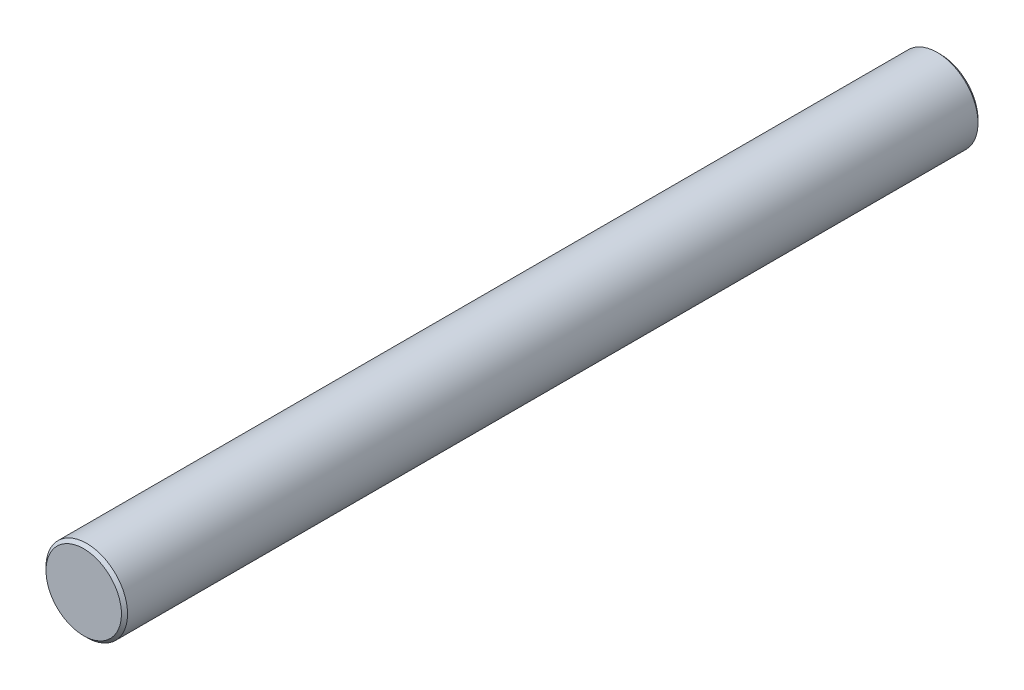
ISO-10303-21;
HEADER;
FILE_DESCRIPTION(('STEP AP214'),'2;1');
FILE_NAME('part.step','',(''),(''),'','','');
FILE_SCHEMA(('AUTOMOTIVE_DESIGN { 1 0 10303 214 1 1 1 1 }'));
ENDSEC;
DATA;
#1=APPLICATION_CONTEXT('core data for automotive mechanical design processes');
#2=APPLICATION_PROTOCOL_DEFINITION('international standard','automotive_design',2000,#1);
#3=PRODUCT_CONTEXT('',#1,'mechanical');
#4=PRODUCT('Part','Part','',(#3));
#5=PRODUCT_RELATED_PRODUCT_CATEGORY('part','',(#4));
#6=PRODUCT_DEFINITION_FORMATION('','',#4);
#7=PRODUCT_DEFINITION_CONTEXT('part definition',#1,'design');
#8=PRODUCT_DEFINITION('design','',#6,#7);
#9=PRODUCT_DEFINITION_SHAPE('','',#8);
#10=(LENGTH_UNIT() NAMED_UNIT(*) SI_UNIT(.MILLI.,.METRE.));
#11=(NAMED_UNIT(*) PLANE_ANGLE_UNIT() SI_UNIT($,.RADIAN.));
#12=(NAMED_UNIT(*) SI_UNIT($,.STERADIAN.) SOLID_ANGLE_UNIT());
#13=UNCERTAINTY_MEASURE_WITH_UNIT(LENGTH_MEASURE(1.E-05),#10,'distance_accuracy_value','');
#14=(GEOMETRIC_REPRESENTATION_CONTEXT(3) GLOBAL_UNCERTAINTY_ASSIGNED_CONTEXT((#13)) GLOBAL_UNIT_ASSIGNED_CONTEXT((#10,
#11,#12)) REPRESENTATION_CONTEXT('',''));
#15=CARTESIAN_POINT('',(0.,0.,0.));
#16=DIRECTION('',(0.,0.,1.));
#17=DIRECTION('',(1.,0.,0.));
#18=AXIS2_PLACEMENT_3D('',#15,#16,#17);
#19=CARTESIAN_POINT('',(0.,9.25,0.));
#20=DIRECTION('',(0.,0.,-1.));
#21=DIRECTION('',(0.,1.,0.));
#22=AXIS2_PLACEMENT_3D('',#19,#20,#21);
#23=PLANE('',#22);
#24=CARTESIAN_POINT('',(0.,0.,0.));
#25=DIRECTION('',(0.,0.,-1.));
#26=DIRECTION('',(0.,1.,0.));
#27=AXIS2_PLACEMENT_3D('',#24,#25,#26);
#28=CIRCLE('',#27,18.5);
#29=CARTESIAN_POINT('',(0.,18.5,0.));
#30=VERTEX_POINT('',#29);
#31=EDGE_CURVE('E9',#30,#30,#28,.T.);
#32=ORIENTED_EDGE('',*,*,#31,.T.);
#33=EDGE_LOOP('',(#32));
#34=FACE_BOUND('',#33,.T.);
#35=CARTESIAN_POINT('',(0.,0.,0.));
#36=DIRECTION('',(0.,0.,1.));
#37=DIRECTION('',(-1.,0.,0.));
#38=AXIS2_PLACEMENT_3D('',#35,#36,#37);
#39=CIRCLE('',#38,6.);
#40=CARTESIAN_POINT('',(-6.,0.,0.));
#41=VERTEX_POINT('',#40);
#42=EDGE_CURVE('E52',#41,#41,#39,.T.);
#43=ORIENTED_EDGE('',*,*,#42,.T.);
#44=EDGE_LOOP('',(#43));
#45=FACE_BOUND('',#44,.T.);
#46=ADVANCED_FACE('F15',(#34,#45),#23,.T.);
#47=CARTESIAN_POINT('',(0.,0.,0.75));
#48=DIRECTION('',(0.,0.,1.));
#49=DIRECTION('',(0.,1.,0.));
#50=AXIS2_PLACEMENT_3D('',#47,#48,#49);
#51=CONICAL_SURFACE('',#50,19.25,0.785398163397448);
#52=CARTESIAN_POINT('',(0.,0.,1.5));
#53=DIRECTION('',(0.,0.,-1.));
#54=DIRECTION('',(0.,1.,0.));
#55=AXIS2_PLACEMENT_3D('',#52,#53,#54);
#56=CIRCLE('',#55,20.);
#57=CARTESIAN_POINT('',(0.,20.,1.5));
#58=VERTEX_POINT('',#57);
#59=EDGE_CURVE('E25',#58,#58,#56,.T.);
#60=ORIENTED_EDGE('',*,*,#59,.T.);
#61=EDGE_LOOP('',(#60));
#62=FACE_BOUND('',#61,.T.);
#63=ORIENTED_EDGE('',*,*,#31,.F.);
#64=EDGE_LOOP('',(#63));
#65=FACE_BOUND('',#64,.T.);
#66=ADVANCED_FACE('F121',(#62,#65),#51,.T.);
#67=CARTESIAN_POINT('',(0.,0.,210.));
#68=DIRECTION('',(0.,0.,1.));
#69=DIRECTION('',(0.,1.,0.));
#70=AXIS2_PLACEMENT_3D('',#67,#68,#69);
#71=CYLINDRICAL_SURFACE('',#70,20.);
#72=CARTESIAN_POINT('',(0.,0.,418.5));
#73=DIRECTION('',(0.,0.,-1.));
#74=DIRECTION('',(0.,1.,0.));
#75=AXIS2_PLACEMENT_3D('',#72,#73,#74);
#76=CIRCLE('',#75,20.);
#77=CARTESIAN_POINT('',(0.,20.,418.5));
#78=VERTEX_POINT('',#77);
#79=EDGE_CURVE('E19',#78,#78,#76,.T.);
#80=ORIENTED_EDGE('',*,*,#79,.T.);
#81=EDGE_LOOP('',(#80));
#82=FACE_BOUND('',#81,.T.);
#83=ORIENTED_EDGE('',*,*,#59,.F.);
#84=EDGE_LOOP('',(#83));
#85=FACE_BOUND('',#84,.T.);
#86=CARTESIAN_POINT('',(0.,0.,6.5));
#87=DIRECTION('',(0.,0.,-1.));
#88=DIRECTION('',(0.,1.,0.));
#89=AXIS2_PLACEMENT_3D('',#86,#87,#88);
#90=CIRCLE('',#89,20.);
#91=CARTESIAN_POINT('',(10.5356537528527,-17.,6.5));
#92=VERTEX_POINT('',#91);
#93=CARTESIAN_POINT('',(-10.5356537528527,-17.,6.5));
#94=VERTEX_POINT('',#93);
#95=EDGE_CURVE('E69',#92,#94,#90,.T.);
#96=ORIENTED_EDGE('',*,*,#95,.T.);
#97=DIRECTION('',(0.,0.,1.));
#98=VECTOR('',#97,1.);
#99=CARTESIAN_POINT('',(-10.5356537528527,-17.,8.25));
#100=LINE('',#99,#98);
#101=CARTESIAN_POINT('',(-10.5356537528527,-17.,10.));
#102=VERTEX_POINT('',#101);
#103=EDGE_CURVE('E62',#94,#102,#100,.T.);
#104=ORIENTED_EDGE('',*,*,#103,.T.);
#105=CARTESIAN_POINT('',(0.,0.,10.));
#106=DIRECTION('',(0.,0.,1.));
#107=DIRECTION('',(0.,1.,0.));
#108=AXIS2_PLACEMENT_3D('',#105,#106,#107);
#109=CIRCLE('',#108,20.);
#110=CARTESIAN_POINT('',(10.5356537528527,-17.,10.));
#111=VERTEX_POINT('',#110);
#112=EDGE_CURVE('E75',#102,#111,#109,.T.);
#113=ORIENTED_EDGE('',*,*,#112,.T.);
#114=DIRECTION('',(0.,0.,-1.));
#115=VECTOR('',#114,1.);
#116=CARTESIAN_POINT('',(10.5356537528527,-17.,8.25));
#117=LINE('',#116,#115);
#118=EDGE_CURVE('E60',#111,#92,#117,.T.);
#119=ORIENTED_EDGE('',*,*,#118,.T.);
#120=EDGE_LOOP('',(#96,#104,#113,#119));
#121=FACE_BOUND('',#120,.T.);
#122=ADVANCED_FACE('F17',(#82,#85,#121),#71,.T.);
#123=CARTESIAN_POINT('',(0.,0.,419.25));
#124=DIRECTION('',(0.,0.,-1.));
#125=DIRECTION('',(0.,1.,0.));
#126=AXIS2_PLACEMENT_3D('',#123,#124,#125);
#127=CONICAL_SURFACE('',#126,19.25,0.785398163397448);
#128=CARTESIAN_POINT('',(0.,0.,420.));
#129=DIRECTION('',(0.,0.,-1.));
#130=DIRECTION('',(0.,1.,0.));
#131=AXIS2_PLACEMENT_3D('',#128,#129,#130);
#132=CIRCLE('',#131,18.5);
#133=CARTESIAN_POINT('',(0.,18.5,420.));
#134=VERTEX_POINT('',#133);
#135=EDGE_CURVE('E44',#134,#134,#132,.T.);
#136=ORIENTED_EDGE('',*,*,#135,.T.);
#137=EDGE_LOOP('',(#136));
#138=FACE_BOUND('',#137,.T.);
#139=ORIENTED_EDGE('',*,*,#79,.F.);
#140=EDGE_LOOP('',(#139));
#141=FACE_BOUND('',#140,.T.);
#142=ADVANCED_FACE('F116',(#138,#141),#127,.T.);
#143=CARTESIAN_POINT('',(0.,9.25,420.));
#144=DIRECTION('',(0.,0.,1.));
#145=DIRECTION('',(0.,-1.,0.));
#146=AXIS2_PLACEMENT_3D('',#143,#144,#145);
#147=PLANE('',#146);
#148=ORIENTED_EDGE('',*,*,#135,.F.);
#149=EDGE_LOOP('',(#148));
#150=FACE_BOUND('',#149,.T.);
#151=ADVANCED_FACE('F110',(#150),#147,.T.);
#152=CARTESIAN_POINT('',(0.,0.,26.4586213285198));
#153=DIRECTION('',(0.,0.,-1.));
#154=DIRECTION('',(-1.,0.,0.));
#155=AXIS2_PLACEMENT_3D('',#152,#153,#154);
#156=CONICAL_SURFACE('',#155,2.52640625,1.0471975511966);
#157=CARTESIAN_POINT('',(0.,0.,25.));
#158=DIRECTION('',(0.,0.,1.));
#159=DIRECTION('',(-1.,0.,0.));
#160=AXIS2_PLACEMENT_3D('',#157,#158,#159);
#161=CIRCLE('',#160,5.0528125);
#162=CARTESIAN_POINT('',(-5.0528125,0.,25.));
#163=VERTEX_POINT('',#162);
#164=EDGE_CURVE('E51',#163,#163,#161,.T.);
#165=ORIENTED_EDGE('',*,*,#164,.F.);
#166=EDGE_LOOP('',(#165));
#167=FACE_BOUND('',#166,.T.);
#168=CARTESIAN_POINT('',(0.,0.,27.9172426570397));
#169=VERTEX_POINT('',#168);
#170=VERTEX_LOOP('',#169);
#171=FACE_BOUND('',#170,.T.);
#172=ADVANCED_FACE('F104',(#167,#171),#156,.F.);
#173=CARTESIAN_POINT('',(0.,0.,12.97359375));
#174=DIRECTION('',(0.,0.,-1.));
#175=DIRECTION('',(-1.,0.,0.));
#176=AXIS2_PLACEMENT_3D('',#173,#174,#175);
#177=CYLINDRICAL_SURFACE('',#176,5.0528125);
#178=CARTESIAN_POINT('',(0.,0.,0.9471875));
#179=DIRECTION('',(0.,0.,1.));
#180=DIRECTION('',(-1.,0.,0.));
#181=AXIS2_PLACEMENT_3D('',#178,#179,#180);
#182=CIRCLE('',#181,5.0528125);
#183=CARTESIAN_POINT('',(-5.0528125,0.,0.9471875));
#184=VERTEX_POINT('',#183);
#185=EDGE_CURVE('E57',#184,#184,#182,.T.);
#186=ORIENTED_EDGE('',*,*,#185,.F.);
#187=EDGE_LOOP('',(#186));
#188=FACE_BOUND('',#187,.T.);
#189=ORIENTED_EDGE('',*,*,#164,.T.);
#190=EDGE_LOOP('',(#189));
#191=FACE_BOUND('',#190,.T.);
#192=ADVANCED_FACE('F101',(#188,#191),#177,.F.);
#193=CARTESIAN_POINT('',(0.,0.,0.47359375));
#194=DIRECTION('',(0.,0.,-1.));
#195=DIRECTION('',(-1.,0.,0.));
#196=AXIS2_PLACEMENT_3D('',#193,#194,#195);
#197=CONICAL_SURFACE('',#196,5.52640625,0.785398163397448);
#198=ORIENTED_EDGE('',*,*,#42,.F.);
#199=EDGE_LOOP('',(#198));
#200=FACE_BOUND('',#199,.T.);
#201=ORIENTED_EDGE('',*,*,#185,.T.);
#202=EDGE_LOOP('',(#201));
#203=FACE_BOUND('',#202,.T.);
#204=ADVANCED_FACE('F99',(#200,#203),#197,.F.);
#205=CARTESIAN_POINT('',(0.,-17.,8.25));
#206=DIRECTION('',(0.,-1.,0.));
#207=DIRECTION('',(0.,0.,-1.));
#208=AXIS2_PLACEMENT_3D('',#205,#206,#207);
#209=PLANE('',#208);
#210=ORIENTED_EDGE('',*,*,#103,.F.);
#211=DIRECTION('',(1.,0.,0.));
#212=VECTOR('',#211,1.);
#213=CARTESIAN_POINT('',(0.,-17.,6.5));
#214=LINE('',#213,#212);
#215=EDGE_CURVE('E66',#94,#92,#214,.T.);
#216=ORIENTED_EDGE('',*,*,#215,.T.);
#217=ORIENTED_EDGE('',*,*,#118,.F.);
#218=DIRECTION('',(-1.,0.,0.));
#219=VECTOR('',#218,1.);
#220=CARTESIAN_POINT('',(0.,-17.,10.));
#221=LINE('',#220,#219);
#222=EDGE_CURVE('E72',#111,#102,#221,.T.);
#223=ORIENTED_EDGE('',*,*,#222,.T.);
#224=EDGE_LOOP('',(#210,#216,#217,#223));
#225=FACE_BOUND('',#224,.T.);
#226=ADVANCED_FACE('F131',(#225),#209,.T.);
#227=CARTESIAN_POINT('',(0.,-19.5,6.5));
#228=DIRECTION('',(0.,0.,1.));
#229=DIRECTION('',(1.,0.,0.));
#230=AXIS2_PLACEMENT_3D('',#227,#228,#229);
#231=PLANE('',#230);
#232=ORIENTED_EDGE('',*,*,#95,.F.);
#233=ORIENTED_EDGE('',*,*,#215,.F.);
#234=EDGE_LOOP('',(#232,#233));
#235=FACE_BOUND('',#234,.T.);
#236=ADVANCED_FACE('F135',(#235),#231,.T.);
#237=CARTESIAN_POINT('',(0.,-19.5,10.));
#238=DIRECTION('',(0.,0.,1.));
#239=DIRECTION('',(1.,0.,0.));
#240=AXIS2_PLACEMENT_3D('',#237,#238,#239);
#241=PLANE('',#240);
#242=ORIENTED_EDGE('',*,*,#112,.F.);
#243=ORIENTED_EDGE('',*,*,#222,.F.);
#244=EDGE_LOOP('',(#242,#243));
#245=FACE_BOUND('',#244,.T.);
#246=ADVANCED_FACE('F87',(#245),#241,.F.);
#247=CLOSED_SHELL('',(#46,#66,#122,#142,#151,#172,#192,#204,#226,#236,#246));
#248=MANIFOLD_SOLID_BREP('B1',#247);
#249=ADVANCED_BREP_SHAPE_REPRESENTATION('',(#18,#248),#14);
#250=SHAPE_DEFINITION_REPRESENTATION(#9,#249);
ENDSEC;
END-ISO-10303-21;
